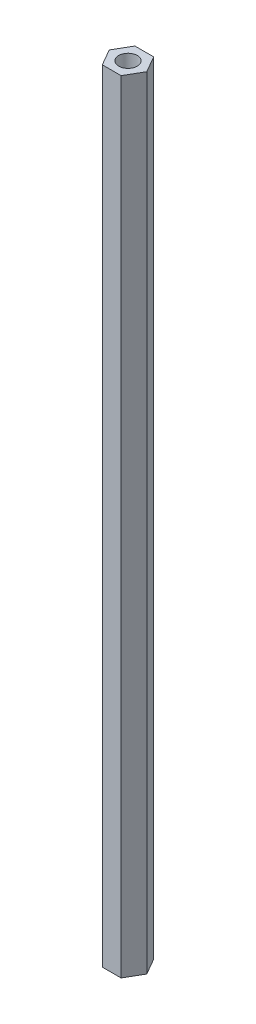
ISO-10303-21;
HEADER;
FILE_DESCRIPTION(('STEP AP214'),'2;1');
FILE_NAME('part.step','',(''),(''),'','','');
FILE_SCHEMA(('AUTOMOTIVE_DESIGN { 1 0 10303 214 1 1 1 1 }'));
ENDSEC;
DATA;
#1=APPLICATION_CONTEXT('core data for automotive mechanical design processes');
#2=APPLICATION_PROTOCOL_DEFINITION('international standard','automotive_design',2000,#1);
#3=PRODUCT_CONTEXT('',#1,'mechanical');
#4=PRODUCT('Part','Part','',(#3));
#5=PRODUCT_RELATED_PRODUCT_CATEGORY('part','',(#4));
#6=PRODUCT_DEFINITION_FORMATION('','',#4);
#7=PRODUCT_DEFINITION_CONTEXT('part definition',#1,'design');
#8=PRODUCT_DEFINITION('design','',#6,#7);
#9=PRODUCT_DEFINITION_SHAPE('','',#8);
#10=(LENGTH_UNIT() NAMED_UNIT(*) SI_UNIT(.MILLI.,.METRE.));
#11=(NAMED_UNIT(*) PLANE_ANGLE_UNIT() SI_UNIT($,.RADIAN.));
#12=(NAMED_UNIT(*) SI_UNIT($,.STERADIAN.) SOLID_ANGLE_UNIT());
#13=UNCERTAINTY_MEASURE_WITH_UNIT(LENGTH_MEASURE(1.E-05),#10,'distance_accuracy_value','');
#14=(GEOMETRIC_REPRESENTATION_CONTEXT(3) GLOBAL_UNCERTAINTY_ASSIGNED_CONTEXT((#13)) GLOBAL_UNIT_ASSIGNED_CONTEXT((#10,
#11,#12)) REPRESENTATION_CONTEXT('',''));
#15=CARTESIAN_POINT('',(0.,0.,0.));
#16=DIRECTION('',(0.,0.,1.));
#17=DIRECTION('',(1.,0.,0.));
#18=AXIS2_PLACEMENT_3D('',#15,#16,#17);
#19=CARTESIAN_POINT('',(0.,168.,0.));
#20=DIRECTION('',(0.,1.,0.));
#21=DIRECTION('',(0.,0.,1.));
#22=AXIS2_PLACEMENT_3D('',#19,#20,#21);
#23=PLANE('',#22);
#24=DIRECTION('',(-1.,0.,0.));
#25=VECTOR('',#24,1.);
#26=CARTESIAN_POINT('',(2.02072594216369,168.,-3.5));
#27=LINE('',#26,#25);
#28=CARTESIAN_POINT('',(2.02072594216369,168.,-3.5));
#29=VERTEX_POINT('',#28);
#30=CARTESIAN_POINT('',(-2.02072594216369,168.,-3.5));
#31=VERTEX_POINT('',#30);
#32=EDGE_CURVE('E154',#29,#31,#27,.T.);
#33=ORIENTED_EDGE('',*,*,#32,.T.);
#34=DIRECTION('',(-0.5,0.,0.866025403784439));
#35=VECTOR('',#34,1.);
#36=CARTESIAN_POINT('',(-2.02072594216369,168.,-3.5));
#37=LINE('',#36,#35);
#38=CARTESIAN_POINT('',(-4.04145188432738,168.,0.));
#39=VERTEX_POINT('',#38);
#40=EDGE_CURVE('E102',#31,#39,#37,.T.);
#41=ORIENTED_EDGE('',*,*,#40,.T.);
#42=DIRECTION('',(0.5,0.,0.866025403784439));
#43=VECTOR('',#42,1.);
#44=CARTESIAN_POINT('',(-4.04145188432738,168.,0.));
#45=LINE('',#44,#43);
#46=CARTESIAN_POINT('',(-2.02072594216369,168.,3.5));
#47=VERTEX_POINT('',#46);
#48=EDGE_CURVE('E115',#39,#47,#45,.T.);
#49=ORIENTED_EDGE('',*,*,#48,.T.);
#50=DIRECTION('',(1.,0.,0.));
#51=VECTOR('',#50,1.);
#52=CARTESIAN_POINT('',(-2.02072594216369,168.,3.5));
#53=LINE('',#52,#51);
#54=CARTESIAN_POINT('',(2.02072594216369,168.,3.5));
#55=VERTEX_POINT('',#54);
#56=EDGE_CURVE('E109',#47,#55,#53,.T.);
#57=ORIENTED_EDGE('',*,*,#56,.T.);
#58=DIRECTION('',(0.5,0.,-0.866025403784439));
#59=VECTOR('',#58,1.);
#60=CARTESIAN_POINT('',(2.02072594216369,168.,3.5));
#61=LINE('',#60,#59);
#62=CARTESIAN_POINT('',(4.04145188432738,168.,0.));
#63=VERTEX_POINT('',#62);
#64=EDGE_CURVE('E113',#55,#63,#61,.T.);
#65=ORIENTED_EDGE('',*,*,#64,.T.);
#66=DIRECTION('',(-0.5,0.,-0.866025403784438));
#67=VECTOR('',#66,1.);
#68=CARTESIAN_POINT('',(4.04145188432738,168.,0.));
#69=LINE('',#68,#67);
#70=EDGE_CURVE('E65',#63,#29,#69,.T.);
#71=ORIENTED_EDGE('',*,*,#70,.T.);
#72=EDGE_LOOP('',(#33,#41,#49,#57,#65,#71));
#73=FACE_BOUND('',#72,.T.);
#74=CARTESIAN_POINT('',(0.,168.,0.));
#75=DIRECTION('',(0.,1.,0.));
#76=DIRECTION('',(0.,0.,1.));
#77=AXIS2_PLACEMENT_3D('',#74,#75,#76);
#78=CIRCLE('',#77,2.);
#79=CARTESIAN_POINT('',(0.,168.,-2.));
#80=VERTEX_POINT('',#79);
#81=EDGE_CURVE('E142',#80,#80,#78,.T.);
#82=ORIENTED_EDGE('',*,*,#81,.F.);
#83=EDGE_LOOP('',(#82));
#84=FACE_BOUND('',#83,.T.);
#85=ADVANCED_FACE('F47',(#73,#84),#23,.T.);
#86=CARTESIAN_POINT('',(0.,0.,0.));
#87=DIRECTION('',(0.,1.,0.));
#88=DIRECTION('',(0.,0.,1.));
#89=AXIS2_PLACEMENT_3D('',#86,#87,#88);
#90=PLANE('',#89);
#91=DIRECTION('',(-1.,0.,0.));
#92=VECTOR('',#91,1.);
#93=CARTESIAN_POINT('',(2.02072594216369,0.,-3.5));
#94=LINE('',#93,#92);
#95=CARTESIAN_POINT('',(2.02072594216369,0.,-3.5));
#96=VERTEX_POINT('',#95);
#97=CARTESIAN_POINT('',(-2.02072594216369,0.,-3.5));
#98=VERTEX_POINT('',#97);
#99=EDGE_CURVE('E137',#96,#98,#94,.T.);
#100=ORIENTED_EDGE('',*,*,#99,.F.);
#101=DIRECTION('',(-0.5,0.,-0.866025403784438));
#102=VECTOR('',#101,1.);
#103=CARTESIAN_POINT('',(4.04145188432738,0.,0.));
#104=LINE('',#103,#102);
#105=CARTESIAN_POINT('',(4.04145188432738,0.,0.));
#106=VERTEX_POINT('',#105);
#107=EDGE_CURVE('E94',#106,#96,#104,.T.);
#108=ORIENTED_EDGE('',*,*,#107,.F.);
#109=DIRECTION('',(0.5,0.,-0.866025403784439));
#110=VECTOR('',#109,1.);
#111=CARTESIAN_POINT('',(2.02072594216369,0.,3.5));
#112=LINE('',#111,#110);
#113=CARTESIAN_POINT('',(2.02072594216369,0.,3.5));
#114=VERTEX_POINT('',#113);
#115=EDGE_CURVE('E88',#114,#106,#112,.T.);
#116=ORIENTED_EDGE('',*,*,#115,.F.);
#117=DIRECTION('',(1.,0.,0.));
#118=VECTOR('',#117,1.);
#119=CARTESIAN_POINT('',(-2.02072594216369,0.,3.5));
#120=LINE('',#119,#118);
#121=CARTESIAN_POINT('',(-2.02072594216369,0.,3.5));
#122=VERTEX_POINT('',#121);
#123=EDGE_CURVE('E124',#122,#114,#120,.T.);
#124=ORIENTED_EDGE('',*,*,#123,.F.);
#125=DIRECTION('',(0.5,0.,0.866025403784439));
#126=VECTOR('',#125,1.);
#127=CARTESIAN_POINT('',(-4.04145188432738,0.,0.));
#128=LINE('',#127,#126);
#129=CARTESIAN_POINT('',(-4.04145188432738,0.,0.));
#130=VERTEX_POINT('',#129);
#131=EDGE_CURVE('E145',#130,#122,#128,.T.);
#132=ORIENTED_EDGE('',*,*,#131,.F.);
#133=DIRECTION('',(-0.5,0.,0.866025403784439));
#134=VECTOR('',#133,1.);
#135=CARTESIAN_POINT('',(-2.02072594216369,0.,-3.5));
#136=LINE('',#135,#134);
#137=EDGE_CURVE('E141',#98,#130,#136,.T.);
#138=ORIENTED_EDGE('',*,*,#137,.F.);
#139=EDGE_LOOP('',(#100,#108,#116,#124,#132,#138));
#140=FACE_BOUND('',#139,.T.);
#141=CARTESIAN_POINT('',(0.,0.,0.));
#142=DIRECTION('',(0.,1.,0.));
#143=DIRECTION('',(0.,0.,1.));
#144=AXIS2_PLACEMENT_3D('',#141,#142,#143);
#145=CIRCLE('',#144,2.);
#146=CARTESIAN_POINT('',(0.,0.,-2.));
#147=VERTEX_POINT('',#146);
#148=EDGE_CURVE('E253',#147,#147,#145,.T.);
#149=ORIENTED_EDGE('',*,*,#148,.T.);
#150=EDGE_LOOP('',(#149));
#151=FACE_BOUND('',#150,.T.);
#152=ADVANCED_FACE('F167',(#140,#151),#90,.F.);
#153=CARTESIAN_POINT('',(2.02072594216369,168.,-3.5));
#154=DIRECTION('',(0.,0.,1.));
#155=DIRECTION('',(1.,0.,0.));
#156=AXIS2_PLACEMENT_3D('',#153,#154,#155);
#157=PLANE('',#156);
#158=ORIENTED_EDGE('',*,*,#99,.T.);
#159=DIRECTION('',(0.,-1.,0.));
#160=VECTOR('',#159,1.);
#161=CARTESIAN_POINT('',(-2.02072594216369,168.,-3.5));
#162=LINE('',#161,#160);
#163=EDGE_CURVE('E11',#31,#98,#162,.T.);
#164=ORIENTED_EDGE('',*,*,#163,.F.);
#165=ORIENTED_EDGE('',*,*,#32,.F.);
#166=DIRECTION('',(0.,-1.,0.));
#167=VECTOR('',#166,1.);
#168=CARTESIAN_POINT('',(2.02072594216369,168.,-3.5));
#169=LINE('',#168,#167);
#170=EDGE_CURVE('E133',#29,#96,#169,.T.);
#171=ORIENTED_EDGE('',*,*,#170,.T.);
#172=EDGE_LOOP('',(#158,#164,#165,#171));
#173=FACE_BOUND('',#172,.T.);
#174=ADVANCED_FACE('F49',(#173),#157,.F.);
#175=CARTESIAN_POINT('',(-2.02072594216369,168.,-3.5));
#176=DIRECTION('',(0.866025403784439,0.,0.5));
#177=DIRECTION('',(0.5,0.,-0.866025403784439));
#178=AXIS2_PLACEMENT_3D('',#175,#176,#177);
#179=PLANE('',#178);
#180=ORIENTED_EDGE('',*,*,#137,.T.);
#181=DIRECTION('',(0.,-1.,0.));
#182=VECTOR('',#181,1.);
#183=CARTESIAN_POINT('',(-4.04145188432738,168.,0.));
#184=LINE('',#183,#182);
#185=EDGE_CURVE('E57',#39,#130,#184,.T.);
#186=ORIENTED_EDGE('',*,*,#185,.F.);
#187=ORIENTED_EDGE('',*,*,#40,.F.);
#188=ORIENTED_EDGE('',*,*,#163,.T.);
#189=EDGE_LOOP('',(#180,#186,#187,#188));
#190=FACE_BOUND('',#189,.T.);
#191=ADVANCED_FACE('F192',(#190),#179,.F.);
#192=CARTESIAN_POINT('',(-4.04145188432738,168.,0.));
#193=DIRECTION('',(0.866025403784438,0.,-0.5));
#194=DIRECTION('',(-0.5,0.,-0.866025403784439));
#195=AXIS2_PLACEMENT_3D('',#192,#193,#194);
#196=PLANE('',#195);
#197=ORIENTED_EDGE('',*,*,#131,.T.);
#198=DIRECTION('',(0.,-1.,0.));
#199=VECTOR('',#198,1.);
#200=CARTESIAN_POINT('',(-2.02072594216369,168.,3.5));
#201=LINE('',#200,#199);
#202=EDGE_CURVE('E126',#47,#122,#201,.T.);
#203=ORIENTED_EDGE('',*,*,#202,.F.);
#204=ORIENTED_EDGE('',*,*,#48,.F.);
#205=ORIENTED_EDGE('',*,*,#185,.T.);
#206=EDGE_LOOP('',(#197,#203,#204,#205));
#207=FACE_BOUND('',#206,.T.);
#208=ADVANCED_FACE('F164',(#207),#196,.F.);
#209=CARTESIAN_POINT('',(-2.02072594216369,168.,3.5));
#210=DIRECTION('',(0.,0.,-1.));
#211=DIRECTION('',(-1.,0.,0.));
#212=AXIS2_PLACEMENT_3D('',#209,#210,#211);
#213=PLANE('',#212);
#214=ORIENTED_EDGE('',*,*,#123,.T.);
#215=DIRECTION('',(0.,-1.,0.));
#216=VECTOR('',#215,1.);
#217=CARTESIAN_POINT('',(2.02072594216369,168.,3.5));
#218=LINE('',#217,#216);
#219=EDGE_CURVE('E121',#55,#114,#218,.T.);
#220=ORIENTED_EDGE('',*,*,#219,.F.);
#221=ORIENTED_EDGE('',*,*,#56,.F.);
#222=ORIENTED_EDGE('',*,*,#202,.T.);
#223=EDGE_LOOP('',(#214,#220,#221,#222));
#224=FACE_BOUND('',#223,.T.);
#225=ADVANCED_FACE('F122',(#224),#213,.F.);
#226=CARTESIAN_POINT('',(2.02072594216369,168.,3.5));
#227=DIRECTION('',(-0.866025403784439,0.,-0.5));
#228=DIRECTION('',(-0.5,0.,0.866025403784439));
#229=AXIS2_PLACEMENT_3D('',#226,#227,#228);
#230=PLANE('',#229);
#231=ORIENTED_EDGE('',*,*,#115,.T.);
#232=DIRECTION('',(0.,-1.,0.));
#233=VECTOR('',#232,1.);
#234=CARTESIAN_POINT('',(4.04145188432738,168.,0.));
#235=LINE('',#234,#233);
#236=EDGE_CURVE('E127',#63,#106,#235,.T.);
#237=ORIENTED_EDGE('',*,*,#236,.F.);
#238=ORIENTED_EDGE('',*,*,#64,.F.);
#239=ORIENTED_EDGE('',*,*,#219,.T.);
#240=EDGE_LOOP('',(#231,#237,#238,#239));
#241=FACE_BOUND('',#240,.T.);
#242=ADVANCED_FACE('F129',(#241),#230,.F.);
#243=CARTESIAN_POINT('',(4.04145188432738,168.,0.));
#244=DIRECTION('',(-0.866025403784438,0.,0.5));
#245=DIRECTION('',(0.5,0.,0.866025403784439));
#246=AXIS2_PLACEMENT_3D('',#243,#244,#245);
#247=PLANE('',#246);
#248=ORIENTED_EDGE('',*,*,#107,.T.);
#249=ORIENTED_EDGE('',*,*,#170,.F.);
#250=ORIENTED_EDGE('',*,*,#70,.F.);
#251=ORIENTED_EDGE('',*,*,#236,.T.);
#252=EDGE_LOOP('',(#248,#249,#250,#251));
#253=FACE_BOUND('',#252,.T.);
#254=ADVANCED_FACE('F172',(#253),#247,.F.);
#255=CARTESIAN_POINT('',(0.,168.,0.));
#256=DIRECTION('',(0.,-1.,0.));
#257=DIRECTION('',(0.,0.,-1.));
#258=AXIS2_PLACEMENT_3D('',#255,#256,#257);
#259=CYLINDRICAL_SURFACE('',#258,2.);
#260=CARTESIAN_POINT('',(0.,168.,-2.));
#261=CARTESIAN_POINT('',(0.,166.25,-2.));
#262=CARTESIAN_POINT('',(0.,164.5,-2.));
#263=CARTESIAN_POINT('',(0.,161.,-2.));
#264=CARTESIAN_POINT('',(0.,159.25,-2.));
#265=CARTESIAN_POINT('',(0.,155.75,-2.));
#266=CARTESIAN_POINT('',(0.,154.,-2.));
#267=CARTESIAN_POINT('',(0.,150.5,-2.));
#268=CARTESIAN_POINT('',(0.,148.75,-2.));
#269=CARTESIAN_POINT('',(0.,145.25,-2.));
#270=CARTESIAN_POINT('',(0.,143.5,-2.));
#271=CARTESIAN_POINT('',(0.,140.,-2.));
#272=CARTESIAN_POINT('',(0.,138.25,-2.));
#273=CARTESIAN_POINT('',(0.,134.75,-2.));
#274=CARTESIAN_POINT('',(0.,133.,-2.));
#275=CARTESIAN_POINT('',(0.,129.5,-2.));
#276=CARTESIAN_POINT('',(0.,127.75,-2.));
#277=CARTESIAN_POINT('',(0.,124.25,-2.));
#278=CARTESIAN_POINT('',(0.,122.5,-2.));
#279=CARTESIAN_POINT('',(0.,119.,-2.));
#280=CARTESIAN_POINT('',(0.,117.25,-2.));
#281=CARTESIAN_POINT('',(0.,113.75,-2.));
#282=CARTESIAN_POINT('',(0.,112.,-2.));
#283=CARTESIAN_POINT('',(0.,108.5,-2.));
#284=CARTESIAN_POINT('',(0.,106.75,-2.));
#285=CARTESIAN_POINT('',(0.,103.25,-2.));
#286=CARTESIAN_POINT('',(0.,101.5,-2.));
#287=CARTESIAN_POINT('',(0.,98.,-2.));
#288=CARTESIAN_POINT('',(0.,96.25,-2.));
#289=CARTESIAN_POINT('',(0.,92.75,-2.));
#290=CARTESIAN_POINT('',(0.,91.,-2.));
#291=CARTESIAN_POINT('',(0.,87.5,-2.));
#292=CARTESIAN_POINT('',(0.,85.75,-2.));
#293=CARTESIAN_POINT('',(0.,82.25,-2.));
#294=CARTESIAN_POINT('',(0.,80.5,-2.));
#295=CARTESIAN_POINT('',(0.,77.,-2.));
#296=CARTESIAN_POINT('',(0.,75.25,-2.));
#297=CARTESIAN_POINT('',(0.,71.75,-2.));
#298=CARTESIAN_POINT('',(0.,70.,-2.));
#299=CARTESIAN_POINT('',(0.,66.5,-2.));
#300=CARTESIAN_POINT('',(0.,64.75,-2.));
#301=CARTESIAN_POINT('',(0.,61.25,-2.));
#302=CARTESIAN_POINT('',(0.,59.5,-2.));
#303=CARTESIAN_POINT('',(0.,56.,-2.));
#304=CARTESIAN_POINT('',(0.,54.25,-2.));
#305=CARTESIAN_POINT('',(0.,50.75,-2.));
#306=CARTESIAN_POINT('',(0.,49.,-2.));
#307=CARTESIAN_POINT('',(0.,45.5,-2.));
#308=CARTESIAN_POINT('',(0.,43.75,-2.));
#309=CARTESIAN_POINT('',(0.,40.25,-2.));
#310=CARTESIAN_POINT('',(0.,38.5,-2.));
#311=CARTESIAN_POINT('',(0.,35.,-2.));
#312=CARTESIAN_POINT('',(0.,33.25,-2.));
#313=CARTESIAN_POINT('',(0.,29.75,-2.));
#314=CARTESIAN_POINT('',(0.,28.,-2.));
#315=CARTESIAN_POINT('',(0.,24.5,-2.));
#316=CARTESIAN_POINT('',(0.,22.75,-2.));
#317=CARTESIAN_POINT('',(0.,19.25,-2.));
#318=CARTESIAN_POINT('',(0.,17.5,-2.));
#319=CARTESIAN_POINT('',(0.,14.,-2.));
#320=CARTESIAN_POINT('',(0.,12.25,-2.));
#321=CARTESIAN_POINT('',(0.,8.75000000000001,-2.));
#322=CARTESIAN_POINT('',(0.,7.00000000000001,-2.));
#323=CARTESIAN_POINT('',(0.,3.5,-2.));
#324=CARTESIAN_POINT('',(0.,1.75,-2.));
#325=CARTESIAN_POINT('',(0.,0.,-2.));
#326=B_SPLINE_CURVE_WITH_KNOTS('',3,(#260,#261,#262,#263,#264,#265,#266,#267,#268,#269,#270,
#271,#272,#273,#274,#275,#276,#277,#278,#279,#280,#281,#282,#283,#284,#285,#286,#287,#288,#289,
#290,#291,#292,#293,#294,#295,#296,#297,#298,#299,#300,#301,#302,#303,#304,#305,#306,#307,#308,
#309,#310,#311,#312,#313,#314,#315,#316,#317,#318,#319,#320,#321,#322,#323,#324,#325),
.UNSPECIFIED.,.F.,.F.,(4,2,2,2,2,2,2,2,2,2,2,2,2,2,2,2,2,2,2,2,2,2,2,2,2,2,2,2,2,2,2,2,4),(0.,
5.25,10.5,15.75,21.,26.25,31.5,36.75,42.,47.25,52.5,57.75,63.,68.25,73.5,78.75,84.,89.25,94.5,
99.75,105.,110.25,115.5,120.75,126.,131.25,136.5,141.75,147.,152.25,157.5,162.75,168.),.UNSPECIFIED.);
#327=EDGE_CURVE('BSEAM174',#80,#147,#326,.T.);
#328=ORIENTED_EDGE('',*,*,#81,.T.);
#329=ORIENTED_EDGE('',*,*,#148,.F.);
#330=ORIENTED_EDGE('',*,*,#327,.T.);
#331=ORIENTED_EDGE('',*,*,#327,.F.);
#332=EDGE_LOOP('',(#328,#330,#329,#331));
#333=FACE_BOUND('',#332,.T.);
#334=ADVANCED_FACE('F174',(#333),#259,.F.);
#335=CLOSED_SHELL('',(#85,#152,#174,#191,#208,#225,#242,#254,#334));
#336=MANIFOLD_SOLID_BREP('B2',#335);
#337=ADVANCED_BREP_SHAPE_REPRESENTATION('',(#18,#336),#14);
#338=SHAPE_DEFINITION_REPRESENTATION(#9,#337);
ENDSEC;
END-ISO-10303-21;
